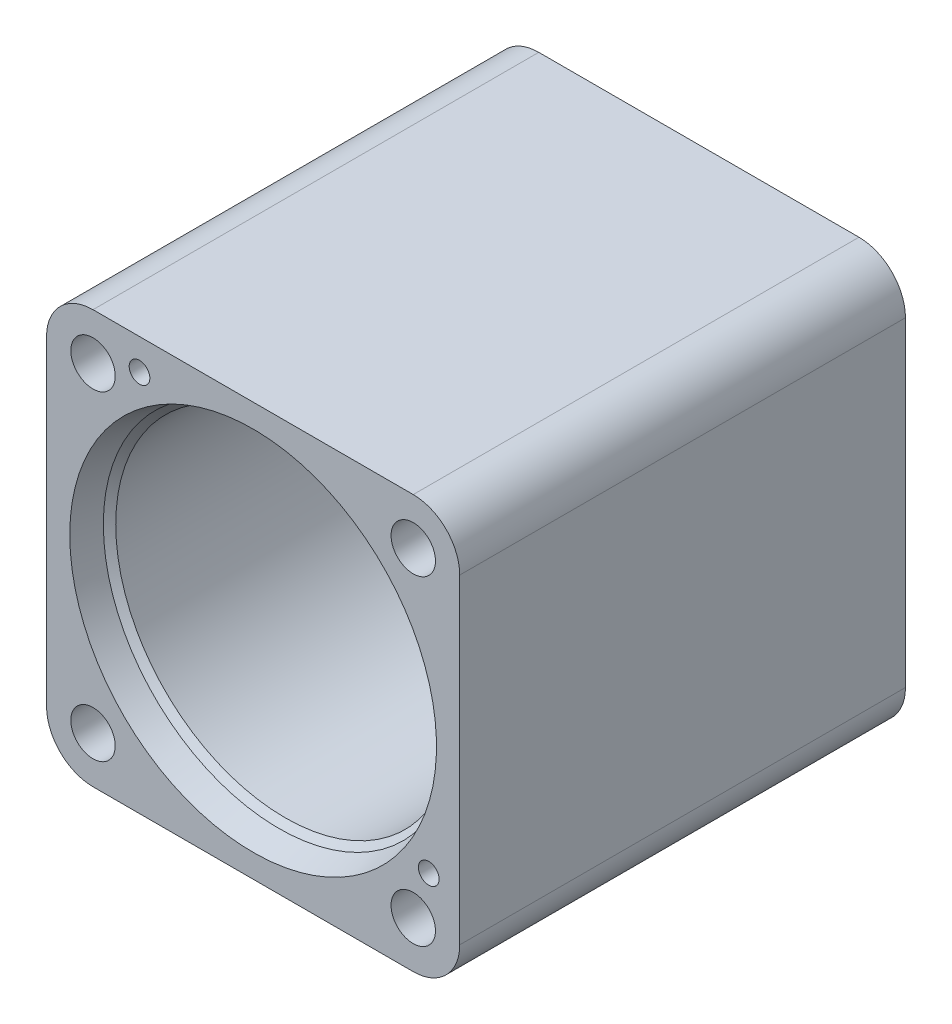
ISO-10303-21;
HEADER;
FILE_DESCRIPTION(('STEP AP214'),'2;1');
FILE_NAME('part.step','',(''),(''),'','','');
FILE_SCHEMA(('AUTOMOTIVE_DESIGN { 1 0 10303 214 1 1 1 1 }'));
ENDSEC;
DATA;
#1=APPLICATION_CONTEXT('core data for automotive mechanical design processes');
#2=APPLICATION_PROTOCOL_DEFINITION('international standard','automotive_design',2000,#1);
#3=PRODUCT_CONTEXT('',#1,'mechanical');
#4=PRODUCT('Part','Part','',(#3));
#5=PRODUCT_RELATED_PRODUCT_CATEGORY('part','',(#4));
#6=PRODUCT_DEFINITION_FORMATION('','',#4);
#7=PRODUCT_DEFINITION_CONTEXT('part definition',#1,'design');
#8=PRODUCT_DEFINITION('design','',#6,#7);
#9=PRODUCT_DEFINITION_SHAPE('','',#8);
#10=(LENGTH_UNIT() NAMED_UNIT(*) SI_UNIT(.MILLI.,.METRE.));
#11=(NAMED_UNIT(*) PLANE_ANGLE_UNIT() SI_UNIT($,.RADIAN.));
#12=(NAMED_UNIT(*) SI_UNIT($,.STERADIAN.) SOLID_ANGLE_UNIT());
#13=UNCERTAINTY_MEASURE_WITH_UNIT(LENGTH_MEASURE(1.E-05),#10,'distance_accuracy_value','');
#14=(GEOMETRIC_REPRESENTATION_CONTEXT(3) GLOBAL_UNCERTAINTY_ASSIGNED_CONTEXT((#13)) GLOBAL_UNIT_ASSIGNED_CONTEXT((#10,
#11,#12)) REPRESENTATION_CONTEXT('',''));
#15=CARTESIAN_POINT('',(0.,0.,0.));
#16=DIRECTION('',(0.,0.,1.));
#17=DIRECTION('',(1.,0.,0.));
#18=AXIS2_PLACEMENT_3D('',#15,#16,#17);
#19=CARTESIAN_POINT('',(0.,0.,43.15));
#20=DIRECTION('',(0.,0.,-1.));
#21=DIRECTION('',(-1.,0.,0.));
#22=AXIS2_PLACEMENT_3D('',#19,#20,#21);
#23=CYLINDRICAL_SURFACE('',#22,16.4);
#24=CARTESIAN_POINT('',(0.,0.,3.1));
#25=DIRECTION('',(0.,0.,-1.));
#26=DIRECTION('',(-1.,0.,0.));
#27=AXIS2_PLACEMENT_3D('',#24,#25,#26);
#28=CIRCLE('',#27,16.4);
#29=CARTESIAN_POINT('',(-16.4,0.,3.1));
#30=VERTEX_POINT('',#29);
#31=EDGE_CURVE('E255',#30,#30,#28,.T.);
#32=ORIENTED_EDGE('',*,*,#31,.T.);
#33=EDGE_LOOP('',(#32));
#34=FACE_BOUND('',#33,.T.);
#35=CARTESIAN_POINT('',(0.,0.,40.05));
#36=DIRECTION('',(0.,0.,-1.));
#37=DIRECTION('',(-1.,0.,0.));
#38=AXIS2_PLACEMENT_3D('',#35,#36,#37);
#39=CIRCLE('',#38,16.4);
#40=CARTESIAN_POINT('',(-16.4,0.,40.05));
#41=VERTEX_POINT('',#40);
#42=EDGE_CURVE('E267',#41,#41,#39,.T.);
#43=ORIENTED_EDGE('',*,*,#42,.F.);
#44=EDGE_LOOP('',(#43));
#45=FACE_BOUND('',#44,.T.);
#46=ADVANCED_FACE('F45',(#34,#45),#23,.F.);
#47=CARTESIAN_POINT('',(-15.5000000000001,-15.5000000000001,43.15));
#48=DIRECTION('',(0.,0.,-1.));
#49=DIRECTION('',(-1.,0.,0.));
#50=AXIS2_PLACEMENT_3D('',#47,#48,#49);
#51=PLANE('',#50);
#52=CARTESIAN_POINT('',(-11.0000000000001,16.9999999999999,43.15));
#53=DIRECTION('',(0.,0.,1.));
#54=DIRECTION('',(1.,0.,0.));
#55=AXIS2_PLACEMENT_3D('',#52,#53,#54);
#56=CIRCLE('',#55,1.);
#57=CARTESIAN_POINT('',(-10.0000000000001,16.9999999999999,43.15));
#58=VERTEX_POINT('',#57);
#59=EDGE_CURVE('E280',#58,#58,#56,.T.);
#60=ORIENTED_EDGE('',*,*,#59,.F.);
#61=EDGE_LOOP('',(#60));
#62=FACE_BOUND('',#61,.T.);
#63=CARTESIAN_POINT('',(16.9999999999999,-11.0000000000001,43.15));
#64=DIRECTION('',(0.,0.,1.));
#65=DIRECTION('',(-1.,0.,0.));
#66=AXIS2_PLACEMENT_3D('',#63,#64,#65);
#67=CIRCLE('',#66,0.999999999999997);
#68=CARTESIAN_POINT('',(15.9999999999999,-11.0000000000001,43.15));
#69=VERTEX_POINT('',#68);
#70=EDGE_CURVE('E276',#69,#69,#67,.T.);
#71=ORIENTED_EDGE('',*,*,#70,.F.);
#72=EDGE_LOOP('',(#71));
#73=FACE_BOUND('',#72,.T.);
#74=CARTESIAN_POINT('',(0.,0.,43.15));
#75=DIRECTION('',(0.,0.,-1.));
#76=DIRECTION('',(-1.,0.,0.));
#77=AXIS2_PLACEMENT_3D('',#74,#75,#76);
#78=CIRCLE('',#77,17.75);
#79=CARTESIAN_POINT('',(-17.75,0.,43.15));
#80=VERTEX_POINT('',#79);
#81=EDGE_CURVE('E259',#80,#80,#78,.T.);
#82=ORIENTED_EDGE('',*,*,#81,.T.);
#83=EDGE_LOOP('',(#82));
#84=FACE_BOUND('',#83,.T.);
#85=CARTESIAN_POINT('',(-15.5000000000001,-15.5000000000001,43.15));
#86=DIRECTION('',(0.,0.,1.));
#87=DIRECTION('',(-1.,0.,0.));
#88=AXIS2_PLACEMENT_3D('',#85,#86,#87);
#89=CIRCLE('',#88,4.5);
#90=CARTESIAN_POINT('',(-20.0000000000001,-15.5000000000001,43.15));
#91=VERTEX_POINT('',#90);
#92=CARTESIAN_POINT('',(-15.5,-20.0000000000001,43.15));
#93=VERTEX_POINT('',#92);
#94=EDGE_CURVE('E171',#91,#93,#89,.T.);
#95=ORIENTED_EDGE('',*,*,#94,.T.);
#96=DIRECTION('',(1.,0.,0.));
#97=VECTOR('',#96,1.);
#98=CARTESIAN_POINT('',(-15.5,-20.0000000000001,43.15));
#99=LINE('',#98,#97);
#100=CARTESIAN_POINT('',(15.4999999999999,-20.0000000000001,43.15));
#101=VERTEX_POINT('',#100);
#102=EDGE_CURVE('E106',#93,#101,#99,.T.);
#103=ORIENTED_EDGE('',*,*,#102,.T.);
#104=CARTESIAN_POINT('',(15.4999999999999,-15.5000000000001,43.15));
#105=DIRECTION('',(0.,0.,1.));
#106=DIRECTION('',(1.,0.,0.));
#107=AXIS2_PLACEMENT_3D('',#104,#105,#106);
#108=CIRCLE('',#107,4.5);
#109=CARTESIAN_POINT('',(19.9999999999999,-15.5000000000001,43.15));
#110=VERTEX_POINT('',#109);
#111=EDGE_CURVE('E192',#101,#110,#108,.T.);
#112=ORIENTED_EDGE('',*,*,#111,.T.);
#113=DIRECTION('',(0.,1.,0.));
#114=VECTOR('',#113,1.);
#115=CARTESIAN_POINT('',(19.9999999999999,-15.5000000000001,43.15));
#116=LINE('',#115,#114);
#117=CARTESIAN_POINT('',(19.9999999999999,15.4999999999999,43.15));
#118=VERTEX_POINT('',#117);
#119=EDGE_CURVE('E206',#110,#118,#116,.T.);
#120=ORIENTED_EDGE('',*,*,#119,.T.);
#121=CARTESIAN_POINT('',(15.4999999999999,15.4999999999999,43.15));
#122=DIRECTION('',(0.,0.,1.));
#123=DIRECTION('',(-1.,0.,0.));
#124=AXIS2_PLACEMENT_3D('',#121,#122,#123);
#125=CIRCLE('',#124,4.5);
#126=CARTESIAN_POINT('',(15.4999999999999,19.9999999999999,43.15));
#127=VERTEX_POINT('',#126);
#128=EDGE_CURVE('E126',#118,#127,#125,.T.);
#129=ORIENTED_EDGE('',*,*,#128,.T.);
#130=DIRECTION('',(-1.,0.,0.));
#131=VECTOR('',#130,1.);
#132=CARTESIAN_POINT('',(-15.5,19.9999999999999,43.15));
#133=LINE('',#132,#131);
#134=CARTESIAN_POINT('',(-15.5,19.9999999999999,43.15));
#135=VERTEX_POINT('',#134);
#136=EDGE_CURVE('E119',#127,#135,#133,.T.);
#137=ORIENTED_EDGE('',*,*,#136,.T.);
#138=CARTESIAN_POINT('',(-15.5000000000001,15.4999999999999,43.15));
#139=DIRECTION('',(0.,0.,1.));
#140=DIRECTION('',(-1.,0.,0.));
#141=AXIS2_PLACEMENT_3D('',#138,#139,#140);
#142=CIRCLE('',#141,4.5);
#143=CARTESIAN_POINT('',(-20.0000000000001,15.4999999999999,43.15));
#144=VERTEX_POINT('',#143);
#145=EDGE_CURVE('E124',#135,#144,#142,.T.);
#146=ORIENTED_EDGE('',*,*,#145,.T.);
#147=DIRECTION('',(0.,-1.,0.));
#148=VECTOR('',#147,1.);
#149=CARTESIAN_POINT('',(-20.0000000000001,-15.5000000000001,43.15));
#150=LINE('',#149,#148);
#151=EDGE_CURVE('E63',#144,#91,#150,.T.);
#152=ORIENTED_EDGE('',*,*,#151,.T.);
#153=EDGE_LOOP('',(#95,#103,#112,#120,#129,#137,#146,#152));
#154=FACE_BOUND('',#153,.T.);
#155=CARTESIAN_POINT('',(-15.5000000000001,15.4999999999999,43.15));
#156=DIRECTION('',(0.,0.,1.));
#157=DIRECTION('',(1.,0.,0.));
#158=AXIS2_PLACEMENT_3D('',#155,#156,#157);
#159=CIRCLE('',#158,2.15);
#160=CARTESIAN_POINT('',(-13.3500000000001,15.4999999999999,43.15));
#161=VERTEX_POINT('',#160);
#162=EDGE_CURVE('E153',#161,#161,#159,.T.);
#163=ORIENTED_EDGE('',*,*,#162,.F.);
#164=EDGE_LOOP('',(#163));
#165=FACE_BOUND('',#164,.T.);
#166=CARTESIAN_POINT('',(15.5,15.5,43.15));
#167=DIRECTION('',(0.,0.,1.));
#168=DIRECTION('',(1.,0.,0.));
#169=AXIS2_PLACEMENT_3D('',#166,#167,#168);
#170=CIRCLE('',#169,2.15);
#171=CARTESIAN_POINT('',(17.65,15.5,43.15));
#172=VERTEX_POINT('',#171);
#173=EDGE_CURVE('E220',#172,#172,#170,.T.);
#174=ORIENTED_EDGE('',*,*,#173,.F.);
#175=EDGE_LOOP('',(#174));
#176=FACE_BOUND('',#175,.T.);
#177=CARTESIAN_POINT('',(15.5,-15.5,43.15));
#178=DIRECTION('',(0.,0.,1.));
#179=DIRECTION('',(1.,0.,0.));
#180=AXIS2_PLACEMENT_3D('',#177,#178,#179);
#181=CIRCLE('',#180,2.15);
#182=CARTESIAN_POINT('',(17.65,-15.5,43.15));
#183=VERTEX_POINT('',#182);
#184=EDGE_CURVE('E228',#183,#183,#181,.T.);
#185=ORIENTED_EDGE('',*,*,#184,.F.);
#186=EDGE_LOOP('',(#185));
#187=FACE_BOUND('',#186,.T.);
#188=CARTESIAN_POINT('',(-15.5000000000001,-15.4999999999999,43.15));
#189=DIRECTION('',(0.,0.,1.));
#190=DIRECTION('',(1.,0.,0.));
#191=AXIS2_PLACEMENT_3D('',#188,#189,#190);
#192=CIRCLE('',#191,2.15);
#193=CARTESIAN_POINT('',(-13.3500000000001,-15.4999999999999,43.15));
#194=VERTEX_POINT('',#193);
#195=EDGE_CURVE('E236',#194,#194,#192,.T.);
#196=ORIENTED_EDGE('',*,*,#195,.F.);
#197=EDGE_LOOP('',(#196));
#198=FACE_BOUND('',#197,.T.);
#199=ADVANCED_FACE('F121',(#62,#73,#84,#154,#165,#176,#187,#198),#51,.F.);
#200=CARTESIAN_POINT('',(-15.5000000000001,-15.5000000000001,0.));
#201=DIRECTION('',(0.,0.,-1.));
#202=DIRECTION('',(-1.,0.,0.));
#203=AXIS2_PLACEMENT_3D('',#200,#201,#202);
#204=PLANE('',#203);
#205=CARTESIAN_POINT('',(0.,0.,0.));
#206=DIRECTION('',(0.,0.,-1.));
#207=DIRECTION('',(-1.,0.,0.));
#208=AXIS2_PLACEMENT_3D('',#205,#206,#207);
#209=CIRCLE('',#208,17.75);
#210=CARTESIAN_POINT('',(-17.75,0.,0.));
#211=VERTEX_POINT('',#210);
#212=EDGE_CURVE('E244',#211,#211,#209,.T.);
#213=ORIENTED_EDGE('',*,*,#212,.F.);
#214=EDGE_LOOP('',(#213));
#215=FACE_BOUND('',#214,.T.);
#216=CARTESIAN_POINT('',(15.5,-15.5,0.));
#217=DIRECTION('',(0.,0.,1.));
#218=DIRECTION('',(1.,0.,0.));
#219=AXIS2_PLACEMENT_3D('',#216,#217,#218);
#220=CIRCLE('',#219,2.15);
#221=CARTESIAN_POINT('',(17.65,-15.5,0.));
#222=VERTEX_POINT('',#221);
#223=EDGE_CURVE('E232',#222,#222,#220,.T.);
#224=ORIENTED_EDGE('',*,*,#223,.T.);
#225=EDGE_LOOP('',(#224));
#226=FACE_BOUND('',#225,.T.);
#227=CARTESIAN_POINT('',(-15.5000000000001,15.4999999999999,0.));
#228=DIRECTION('',(0.,0.,1.));
#229=DIRECTION('',(1.,0.,0.));
#230=AXIS2_PLACEMENT_3D('',#227,#228,#229);
#231=CIRCLE('',#230,2.15);
#232=CARTESIAN_POINT('',(-13.3500000000001,15.4999999999999,0.));
#233=VERTEX_POINT('',#232);
#234=EDGE_CURVE('E216',#233,#233,#231,.T.);
#235=ORIENTED_EDGE('',*,*,#234,.T.);
#236=EDGE_LOOP('',(#235));
#237=FACE_BOUND('',#236,.T.);
#238=CARTESIAN_POINT('',(-15.5000000000001,-15.5000000000001,0.));
#239=DIRECTION('',(0.,0.,1.));
#240=DIRECTION('',(-1.,0.,0.));
#241=AXIS2_PLACEMENT_3D('',#238,#239,#240);
#242=CIRCLE('',#241,4.5);
#243=CARTESIAN_POINT('',(-20.0000000000001,-15.5000000000001,0.));
#244=VERTEX_POINT('',#243);
#245=CARTESIAN_POINT('',(-15.5,-20.0000000000001,0.));
#246=VERTEX_POINT('',#245);
#247=EDGE_CURVE('E148',#244,#246,#242,.T.);
#248=ORIENTED_EDGE('',*,*,#247,.F.);
#249=DIRECTION('',(0.,-1.,0.));
#250=VECTOR('',#249,1.);
#251=CARTESIAN_POINT('',(-20.0000000000001,-15.5000000000001,0.));
#252=LINE('',#251,#250);
#253=CARTESIAN_POINT('',(-20.0000000000001,15.4999999999999,0.));
#254=VERTEX_POINT('',#253);
#255=EDGE_CURVE('E98',#254,#244,#252,.T.);
#256=ORIENTED_EDGE('',*,*,#255,.F.);
#257=CARTESIAN_POINT('',(-15.5000000000001,15.4999999999999,0.));
#258=DIRECTION('',(0.,0.,1.));
#259=DIRECTION('',(-1.,0.,0.));
#260=AXIS2_PLACEMENT_3D('',#257,#258,#259);
#261=CIRCLE('',#260,4.5);
#262=CARTESIAN_POINT('',(-15.5,19.9999999999999,0.));
#263=VERTEX_POINT('',#262);
#264=EDGE_CURVE('E92',#263,#254,#261,.T.);
#265=ORIENTED_EDGE('',*,*,#264,.F.);
#266=DIRECTION('',(-1.,0.,0.));
#267=VECTOR('',#266,1.);
#268=CARTESIAN_POINT('',(-15.5,19.9999999999999,0.));
#269=LINE('',#268,#267);
#270=CARTESIAN_POINT('',(15.4999999999999,19.9999999999999,0.));
#271=VERTEX_POINT('',#270);
#272=EDGE_CURVE('E135',#271,#263,#269,.T.);
#273=ORIENTED_EDGE('',*,*,#272,.F.);
#274=CARTESIAN_POINT('',(15.4999999999999,15.4999999999999,0.));
#275=DIRECTION('',(0.,0.,1.));
#276=DIRECTION('',(-1.,0.,0.));
#277=AXIS2_PLACEMENT_3D('',#274,#275,#276);
#278=CIRCLE('',#277,4.5);
#279=CARTESIAN_POINT('',(19.9999999999999,15.4999999999999,0.));
#280=VERTEX_POINT('',#279);
#281=EDGE_CURVE('E162',#280,#271,#278,.T.);
#282=ORIENTED_EDGE('',*,*,#281,.F.);
#283=DIRECTION('',(0.,1.,0.));
#284=VECTOR('',#283,1.);
#285=CARTESIAN_POINT('',(19.9999999999999,-15.5000000000001,0.));
#286=LINE('',#285,#284);
#287=CARTESIAN_POINT('',(19.9999999999999,-15.5000000000001,0.));
#288=VERTEX_POINT('',#287);
#289=EDGE_CURVE('E159',#288,#280,#286,.T.);
#290=ORIENTED_EDGE('',*,*,#289,.F.);
#291=CARTESIAN_POINT('',(15.4999999999999,-15.5000000000001,0.));
#292=DIRECTION('',(0.,0.,1.));
#293=DIRECTION('',(1.,0.,0.));
#294=AXIS2_PLACEMENT_3D('',#291,#292,#293);
#295=CIRCLE('',#294,4.5);
#296=CARTESIAN_POINT('',(15.4999999999999,-20.0000000000001,0.));
#297=VERTEX_POINT('',#296);
#298=EDGE_CURVE('E156',#297,#288,#295,.T.);
#299=ORIENTED_EDGE('',*,*,#298,.F.);
#300=DIRECTION('',(1.,0.,0.));
#301=VECTOR('',#300,1.);
#302=CARTESIAN_POINT('',(-15.5,-20.0000000000001,0.));
#303=LINE('',#302,#301);
#304=EDGE_CURVE('E152',#246,#297,#303,.T.);
#305=ORIENTED_EDGE('',*,*,#304,.F.);
#306=EDGE_LOOP('',(#248,#256,#265,#273,#282,#290,#299,#305));
#307=FACE_BOUND('',#306,.T.);
#308=CARTESIAN_POINT('',(15.5,15.5,0.));
#309=DIRECTION('',(0.,0.,1.));
#310=DIRECTION('',(1.,0.,0.));
#311=AXIS2_PLACEMENT_3D('',#308,#309,#310);
#312=CIRCLE('',#311,2.15);
#313=CARTESIAN_POINT('',(17.65,15.5,0.));
#314=VERTEX_POINT('',#313);
#315=EDGE_CURVE('E224',#314,#314,#312,.T.);
#316=ORIENTED_EDGE('',*,*,#315,.T.);
#317=EDGE_LOOP('',(#316));
#318=FACE_BOUND('',#317,.T.);
#319=CARTESIAN_POINT('',(-15.5000000000001,-15.4999999999999,0.));
#320=DIRECTION('',(0.,0.,1.));
#321=DIRECTION('',(1.,0.,0.));
#322=AXIS2_PLACEMENT_3D('',#319,#320,#321);
#323=CIRCLE('',#322,2.15);
#324=CARTESIAN_POINT('',(-13.3500000000001,-15.4999999999999,0.));
#325=VERTEX_POINT('',#324);
#326=EDGE_CURVE('E240',#325,#325,#323,.T.);
#327=ORIENTED_EDGE('',*,*,#326,.T.);
#328=EDGE_LOOP('',(#327));
#329=FACE_BOUND('',#328,.T.);
#330=ADVANCED_FACE('F196',(#215,#226,#237,#307,#318,#329),#204,.T.);
#331=CARTESIAN_POINT('',(-15.5000000000001,-15.5000000000001,43.15));
#332=DIRECTION('',(0.,0.,-1.));
#333=DIRECTION('',(-1.,0.,0.));
#334=AXIS2_PLACEMENT_3D('',#331,#332,#333);
#335=CYLINDRICAL_SURFACE('',#334,4.5);
#336=ORIENTED_EDGE('',*,*,#247,.T.);
#337=DIRECTION('',(0.,0.,-1.));
#338=VECTOR('',#337,1.);
#339=CARTESIAN_POINT('',(-15.5,-20.0000000000001,43.15));
#340=LINE('',#339,#338);
#341=EDGE_CURVE('E11',#93,#246,#340,.T.);
#342=ORIENTED_EDGE('',*,*,#341,.F.);
#343=ORIENTED_EDGE('',*,*,#94,.F.);
#344=DIRECTION('',(0.,0.,-1.));
#345=VECTOR('',#344,1.);
#346=CARTESIAN_POINT('',(-20.0000000000001,-15.5000000000001,43.15));
#347=LINE('',#346,#345);
#348=EDGE_CURVE('E144',#91,#244,#347,.T.);
#349=ORIENTED_EDGE('',*,*,#348,.T.);
#350=EDGE_LOOP('',(#336,#342,#343,#349));
#351=FACE_BOUND('',#350,.T.);
#352=ADVANCED_FACE('F47',(#351),#335,.T.);
#353=CARTESIAN_POINT('',(-15.5,-20.0000000000001,43.15));
#354=DIRECTION('',(0.,1.,0.));
#355=DIRECTION('',(0.,0.,1.));
#356=AXIS2_PLACEMENT_3D('',#353,#354,#355);
#357=PLANE('',#356);
#358=ORIENTED_EDGE('',*,*,#304,.T.);
#359=DIRECTION('',(0.,0.,-1.));
#360=VECTOR('',#359,1.);
#361=CARTESIAN_POINT('',(15.4999999999999,-20.0000000000001,43.15));
#362=LINE('',#361,#360);
#363=EDGE_CURVE('E55',#101,#297,#362,.T.);
#364=ORIENTED_EDGE('',*,*,#363,.F.);
#365=ORIENTED_EDGE('',*,*,#102,.F.);
#366=ORIENTED_EDGE('',*,*,#341,.T.);
#367=EDGE_LOOP('',(#358,#364,#365,#366));
#368=FACE_BOUND('',#367,.T.);
#369=ADVANCED_FACE('F343',(#368),#357,.F.);
#370=CARTESIAN_POINT('',(15.4999999999999,-15.5000000000001,43.15));
#371=DIRECTION('',(0.,0.,-1.));
#372=DIRECTION('',(-1.,0.,0.));
#373=AXIS2_PLACEMENT_3D('',#370,#371,#372);
#374=CYLINDRICAL_SURFACE('',#373,4.5);
#375=ORIENTED_EDGE('',*,*,#298,.T.);
#376=DIRECTION('',(0.,0.,-1.));
#377=VECTOR('',#376,1.);
#378=CARTESIAN_POINT('',(19.9999999999999,-15.5000000000001,43.15));
#379=LINE('',#378,#377);
#380=EDGE_CURVE('E182',#110,#288,#379,.T.);
#381=ORIENTED_EDGE('',*,*,#380,.F.);
#382=ORIENTED_EDGE('',*,*,#111,.F.);
#383=ORIENTED_EDGE('',*,*,#363,.T.);
#384=EDGE_LOOP('',(#375,#381,#382,#383));
#385=FACE_BOUND('',#384,.T.);
#386=ADVANCED_FACE('F190',(#385),#374,.T.);
#387=CARTESIAN_POINT('',(19.9999999999999,-15.5000000000001,43.15));
#388=DIRECTION('',(-1.,0.,0.));
#389=DIRECTION('',(0.,0.,1.));
#390=AXIS2_PLACEMENT_3D('',#387,#388,#389);
#391=PLANE('',#390);
#392=ORIENTED_EDGE('',*,*,#289,.T.);
#393=DIRECTION('',(0.,0.,-1.));
#394=VECTOR('',#393,1.);
#395=CARTESIAN_POINT('',(19.9999999999999,15.4999999999999,43.15));
#396=LINE('',#395,#394);
#397=EDGE_CURVE('E178',#118,#280,#396,.T.);
#398=ORIENTED_EDGE('',*,*,#397,.F.);
#399=ORIENTED_EDGE('',*,*,#119,.F.);
#400=ORIENTED_EDGE('',*,*,#380,.T.);
#401=EDGE_LOOP('',(#392,#398,#399,#400));
#402=FACE_BOUND('',#401,.T.);
#403=ADVANCED_FACE('F201',(#402),#391,.F.);
#404=CARTESIAN_POINT('',(15.4999999999999,15.4999999999999,43.15));
#405=DIRECTION('',(0.,0.,-1.));
#406=DIRECTION('',(-1.,0.,0.));
#407=AXIS2_PLACEMENT_3D('',#404,#405,#406);
#408=CYLINDRICAL_SURFACE('',#407,4.5);
#409=ORIENTED_EDGE('',*,*,#281,.T.);
#410=DIRECTION('',(0.,0.,-1.));
#411=VECTOR('',#410,1.);
#412=CARTESIAN_POINT('',(15.4999999999999,19.9999999999999,43.15));
#413=LINE('',#412,#411);
#414=EDGE_CURVE('E137',#127,#271,#413,.T.);
#415=ORIENTED_EDGE('',*,*,#414,.F.);
#416=ORIENTED_EDGE('',*,*,#128,.F.);
#417=ORIENTED_EDGE('',*,*,#397,.T.);
#418=EDGE_LOOP('',(#409,#415,#416,#417));
#419=FACE_BOUND('',#418,.T.);
#420=ADVANCED_FACE('F204',(#419),#408,.T.);
#421=CARTESIAN_POINT('',(-15.5,19.9999999999999,43.15));
#422=DIRECTION('',(0.,-1.,0.));
#423=DIRECTION('',(0.,0.,-1.));
#424=AXIS2_PLACEMENT_3D('',#421,#422,#423);
#425=PLANE('',#424);
#426=ORIENTED_EDGE('',*,*,#272,.T.);
#427=DIRECTION('',(0.,0.,-1.));
#428=VECTOR('',#427,1.);
#429=CARTESIAN_POINT('',(-15.5,19.9999999999999,43.15));
#430=LINE('',#429,#428);
#431=EDGE_CURVE('E132',#135,#263,#430,.T.);
#432=ORIENTED_EDGE('',*,*,#431,.F.);
#433=ORIENTED_EDGE('',*,*,#136,.F.);
#434=ORIENTED_EDGE('',*,*,#414,.T.);
#435=EDGE_LOOP('',(#426,#432,#433,#434));
#436=FACE_BOUND('',#435,.T.);
#437=ADVANCED_FACE('F133',(#436),#425,.F.);
#438=CARTESIAN_POINT('',(-15.5000000000001,15.4999999999999,43.15));
#439=DIRECTION('',(0.,0.,-1.));
#440=DIRECTION('',(-1.,0.,0.));
#441=AXIS2_PLACEMENT_3D('',#438,#439,#440);
#442=CYLINDRICAL_SURFACE('',#441,4.5);
#443=ORIENTED_EDGE('',*,*,#264,.T.);
#444=DIRECTION('',(0.,0.,-1.));
#445=VECTOR('',#444,1.);
#446=CARTESIAN_POINT('',(-20.0000000000001,15.4999999999999,43.15));
#447=LINE('',#446,#445);
#448=EDGE_CURVE('E138',#144,#254,#447,.T.);
#449=ORIENTED_EDGE('',*,*,#448,.F.);
#450=ORIENTED_EDGE('',*,*,#145,.F.);
#451=ORIENTED_EDGE('',*,*,#431,.T.);
#452=EDGE_LOOP('',(#443,#449,#450,#451));
#453=FACE_BOUND('',#452,.T.);
#454=ADVANCED_FACE('F140',(#453),#442,.T.);
#455=CARTESIAN_POINT('',(-20.0000000000001,-15.5000000000001,43.15));
#456=DIRECTION('',(1.,0.,0.));
#457=DIRECTION('',(0.,0.,-1.));
#458=AXIS2_PLACEMENT_3D('',#455,#456,#457);
#459=PLANE('',#458);
#460=ORIENTED_EDGE('',*,*,#255,.T.);
#461=ORIENTED_EDGE('',*,*,#348,.F.);
#462=ORIENTED_EDGE('',*,*,#151,.F.);
#463=ORIENTED_EDGE('',*,*,#448,.T.);
#464=EDGE_LOOP('',(#460,#461,#462,#463));
#465=FACE_BOUND('',#464,.T.);
#466=ADVANCED_FACE('F331',(#465),#459,.F.);
#467=CARTESIAN_POINT('',(-15.5000000000001,15.4999999999999,43.15));
#468=DIRECTION('',(0.,0.,-1.));
#469=DIRECTION('',(-1.,0.,0.));
#470=AXIS2_PLACEMENT_3D('',#467,#468,#469);
#471=CYLINDRICAL_SURFACE('',#470,2.15);
#472=ORIENTED_EDGE('',*,*,#162,.T.);
#473=EDGE_LOOP('',(#472));
#474=FACE_BOUND('',#473,.T.);
#475=ORIENTED_EDGE('',*,*,#234,.F.);
#476=EDGE_LOOP('',(#475));
#477=FACE_BOUND('',#476,.T.);
#478=ADVANCED_FACE('F325',(#474,#477),#471,.F.);
#479=CARTESIAN_POINT('',(15.5,15.5,43.15));
#480=DIRECTION('',(0.,0.,-1.));
#481=DIRECTION('',(-1.,0.,0.));
#482=AXIS2_PLACEMENT_3D('',#479,#480,#481);
#483=CYLINDRICAL_SURFACE('',#482,2.15);
#484=ORIENTED_EDGE('',*,*,#173,.T.);
#485=EDGE_LOOP('',(#484));
#486=FACE_BOUND('',#485,.T.);
#487=ORIENTED_EDGE('',*,*,#315,.F.);
#488=EDGE_LOOP('',(#487));
#489=FACE_BOUND('',#488,.T.);
#490=ADVANCED_FACE('F408',(#486,#489),#483,.F.);
#491=CARTESIAN_POINT('',(15.5,-15.5,43.15));
#492=DIRECTION('',(0.,0.,-1.));
#493=DIRECTION('',(-1.,0.,0.));
#494=AXIS2_PLACEMENT_3D('',#491,#492,#493);
#495=CYLINDRICAL_SURFACE('',#494,2.15);
#496=ORIENTED_EDGE('',*,*,#184,.T.);
#497=EDGE_LOOP('',(#496));
#498=FACE_BOUND('',#497,.T.);
#499=ORIENTED_EDGE('',*,*,#223,.F.);
#500=EDGE_LOOP('',(#499));
#501=FACE_BOUND('',#500,.T.);
#502=ADVANCED_FACE('F417',(#498,#501),#495,.F.);
#503=CARTESIAN_POINT('',(-15.5000000000001,-15.4999999999999,43.15));
#504=DIRECTION('',(0.,0.,-1.));
#505=DIRECTION('',(-1.,0.,0.));
#506=AXIS2_PLACEMENT_3D('',#503,#504,#505);
#507=CYLINDRICAL_SURFACE('',#506,2.15);
#508=ORIENTED_EDGE('',*,*,#195,.T.);
#509=EDGE_LOOP('',(#508));
#510=FACE_BOUND('',#509,.T.);
#511=ORIENTED_EDGE('',*,*,#326,.F.);
#512=EDGE_LOOP('',(#511));
#513=FACE_BOUND('',#512,.T.);
#514=ADVANCED_FACE('F426',(#510,#513),#507,.F.);
#515=CARTESIAN_POINT('',(0.,0.,2.5));
#516=DIRECTION('',(0.,0.,-1.));
#517=DIRECTION('',(-1.,0.,0.));
#518=AXIS2_PLACEMENT_3D('',#515,#516,#517);
#519=CONICAL_SURFACE('',#518,17.,0.291456794477867);
#520=ORIENTED_EDGE('',*,*,#212,.T.);
#521=EDGE_LOOP('',(#520));
#522=FACE_BOUND('',#521,.T.);
#523=CARTESIAN_POINT('',(0.,0.,2.5));
#524=DIRECTION('',(0.,0.,-1.));
#525=DIRECTION('',(-1.,0.,0.));
#526=AXIS2_PLACEMENT_3D('',#523,#524,#525);
#527=CIRCLE('',#526,17.);
#528=CARTESIAN_POINT('',(-17.,0.,2.5));
#529=VERTEX_POINT('',#528);
#530=EDGE_CURVE('E251',#529,#529,#527,.T.);
#531=ORIENTED_EDGE('',*,*,#530,.F.);
#532=EDGE_LOOP('',(#531));
#533=FACE_BOUND('',#532,.T.);
#534=ADVANCED_FACE('F436',(#522,#533),#519,.F.);
#535=CARTESIAN_POINT('',(0.,0.,3.1));
#536=DIRECTION('',(0.,0.,-1.));
#537=DIRECTION('',(-1.,0.,0.));
#538=AXIS2_PLACEMENT_3D('',#535,#536,#537);
#539=CONICAL_SURFACE('',#538,16.4,0.785398163397447);
#540=ORIENTED_EDGE('',*,*,#530,.T.);
#541=EDGE_LOOP('',(#540));
#542=FACE_BOUND('',#541,.T.);
#543=ORIENTED_EDGE('',*,*,#31,.F.);
#544=EDGE_LOOP('',(#543));
#545=FACE_BOUND('',#544,.T.);
#546=ADVANCED_FACE('F308',(#542,#545),#539,.F.);
#547=CARTESIAN_POINT('',(0.,0.,40.65));
#548=DIRECTION('',(0.,0.,1.));
#549=DIRECTION('',(-1.,0.,0.));
#550=AXIS2_PLACEMENT_3D('',#547,#548,#549);
#551=CONICAL_SURFACE('',#550,17.,0.291456794477867);
#552=ORIENTED_EDGE('',*,*,#81,.F.);
#553=EDGE_LOOP('',(#552));
#554=FACE_BOUND('',#553,.T.);
#555=CARTESIAN_POINT('',(0.,0.,40.65));
#556=DIRECTION('',(0.,0.,-1.));
#557=DIRECTION('',(-1.,0.,0.));
#558=AXIS2_PLACEMENT_3D('',#555,#556,#557);
#559=CIRCLE('',#558,17.);
#560=CARTESIAN_POINT('',(-17.,0.,40.65));
#561=VERTEX_POINT('',#560);
#562=EDGE_CURVE('E263',#561,#561,#559,.T.);
#563=ORIENTED_EDGE('',*,*,#562,.T.);
#564=EDGE_LOOP('',(#563));
#565=FACE_BOUND('',#564,.T.);
#566=ADVANCED_FACE('F304',(#554,#565),#551,.F.);
#567=CARTESIAN_POINT('',(0.,0.,40.05));
#568=DIRECTION('',(0.,0.,1.));
#569=DIRECTION('',(-1.,0.,0.));
#570=AXIS2_PLACEMENT_3D('',#567,#568,#569);
#571=CONICAL_SURFACE('',#570,16.4,0.785398163397447);
#572=ORIENTED_EDGE('',*,*,#562,.F.);
#573=EDGE_LOOP('',(#572));
#574=FACE_BOUND('',#573,.T.);
#575=ORIENTED_EDGE('',*,*,#42,.T.);
#576=EDGE_LOOP('',(#575));
#577=FACE_BOUND('',#576,.T.);
#578=ADVANCED_FACE('F307',(#574,#577),#571,.F.);
#579=CARTESIAN_POINT('',(16.9999999999999,-11.0000000000001,38.15));
#580=DIRECTION('',(0.,0.,1.));
#581=DIRECTION('',(1.,0.,0.));
#582=AXIS2_PLACEMENT_3D('',#579,#580,#581);
#583=CYLINDRICAL_SURFACE('',#582,0.999999999999997);
#584=CARTESIAN_POINT('',(16.9999999999999,-11.0000000000001,38.15));
#585=DIRECTION('',(0.,0.,1.));
#586=DIRECTION('',(-1.,0.,0.));
#587=AXIS2_PLACEMENT_3D('',#584,#585,#586);
#588=CIRCLE('',#587,0.999999999999997);
#589=CARTESIAN_POINT('',(15.9999999999999,-11.0000000000001,38.15));
#590=VERTEX_POINT('',#589);
#591=EDGE_CURVE('E272',#590,#590,#588,.T.);
#592=ORIENTED_EDGE('',*,*,#591,.F.);
#593=EDGE_LOOP('',(#592));
#594=FACE_BOUND('',#593,.T.);
#595=ORIENTED_EDGE('',*,*,#70,.T.);
#596=EDGE_LOOP('',(#595));
#597=FACE_BOUND('',#596,.T.);
#598=ADVANCED_FACE('F314',(#594,#597),#583,.F.);
#599=CARTESIAN_POINT('',(16.9999999999999,-11.0000000000001,38.15));
#600=DIRECTION('',(0.,0.,-1.));
#601=DIRECTION('',(-1.,0.,0.));
#602=AXIS2_PLACEMENT_3D('',#599,#600,#601);
#603=PLANE('',#602);
#604=ORIENTED_EDGE('',*,*,#591,.T.);
#605=EDGE_LOOP('',(#604));
#606=FACE_BOUND('',#605,.T.);
#607=ADVANCED_FACE('F293',(#606),#603,.F.);
#608=CARTESIAN_POINT('',(-11.0000000000001,16.9999999999999,38.15));
#609=DIRECTION('',(0.,0.,1.));
#610=DIRECTION('',(1.,0.,0.));
#611=AXIS2_PLACEMENT_3D('',#608,#609,#610);
#612=CYLINDRICAL_SURFACE('',#611,1.);
#613=CARTESIAN_POINT('',(-11.0000000000001,16.9999999999999,38.15));
#614=DIRECTION('',(0.,0.,1.));
#615=DIRECTION('',(1.,0.,0.));
#616=AXIS2_PLACEMENT_3D('',#613,#614,#615);
#617=CIRCLE('',#616,1.);
#618=CARTESIAN_POINT('',(-10.0000000000001,16.9999999999999,38.15));
#619=VERTEX_POINT('',#618);
#620=EDGE_CURVE('E271',#619,#619,#617,.T.);
#621=ORIENTED_EDGE('',*,*,#620,.F.);
#622=EDGE_LOOP('',(#621));
#623=FACE_BOUND('',#622,.T.);
#624=ORIENTED_EDGE('',*,*,#59,.T.);
#625=EDGE_LOOP('',(#624));
#626=FACE_BOUND('',#625,.T.);
#627=ADVANCED_FACE('F290',(#623,#626),#612,.F.);
#628=CARTESIAN_POINT('',(-11.0000000000001,16.9999999999999,38.15));
#629=DIRECTION('',(0.,0.,1.));
#630=DIRECTION('',(1.,0.,0.));
#631=AXIS2_PLACEMENT_3D('',#628,#629,#630);
#632=PLANE('',#631);
#633=ORIENTED_EDGE('',*,*,#620,.T.);
#634=EDGE_LOOP('',(#633));
#635=FACE_BOUND('',#634,.T.);
#636=ADVANCED_FACE('F288',(#635),#632,.T.);
#637=CLOSED_SHELL('',(#46,#199,#330,#352,#369,#386,#403,#420,#437,#454,#466,#478,#490,#502,#514,
#534,#546,#566,#578,#598,#607,#627,#636));
#638=MANIFOLD_SOLID_BREP('B2',#637);
#639=ADVANCED_BREP_SHAPE_REPRESENTATION('',(#18,#638),#14);
#640=SHAPE_DEFINITION_REPRESENTATION(#9,#639);
ENDSEC;
END-ISO-10303-21;
